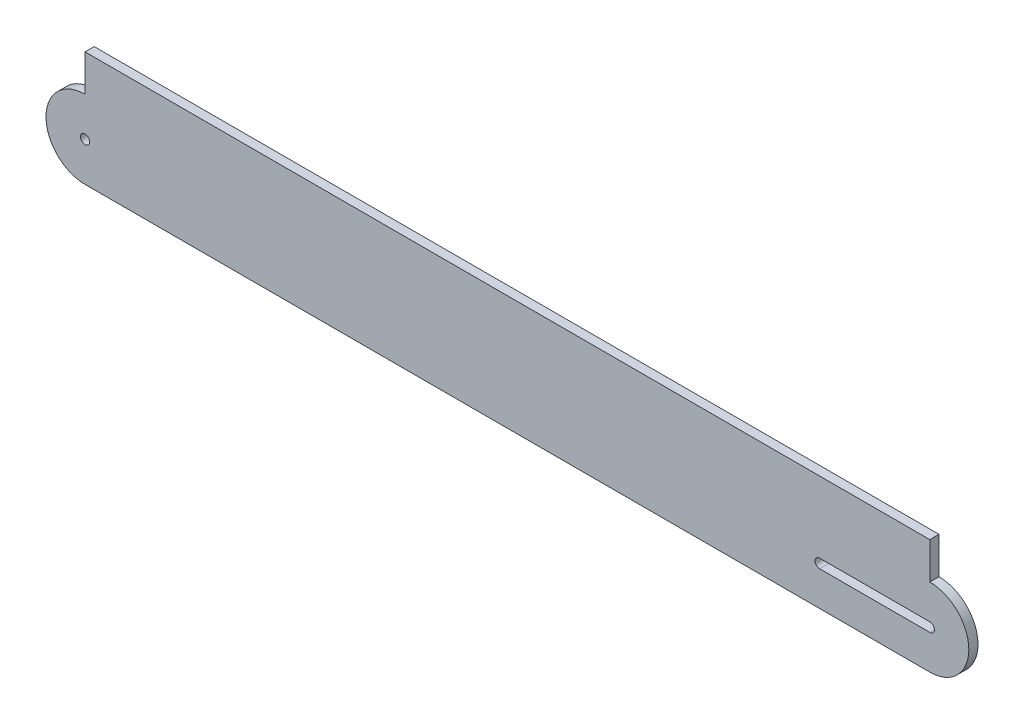
ISO-10303-21;
HEADER;
FILE_DESCRIPTION(('STEP AP214'),'2;1');
FILE_NAME('part.step','',(''),(''),'','','');
FILE_SCHEMA(('AUTOMOTIVE_DESIGN { 1 0 10303 214 1 1 1 1 }'));
ENDSEC;
DATA;
#1=APPLICATION_CONTEXT('core data for automotive mechanical design processes');
#2=APPLICATION_PROTOCOL_DEFINITION('international standard','automotive_design',2000,#1);
#3=PRODUCT_CONTEXT('',#1,'mechanical');
#4=PRODUCT('Part','Part','',(#3));
#5=PRODUCT_RELATED_PRODUCT_CATEGORY('part','',(#4));
#6=PRODUCT_DEFINITION_FORMATION('','',#4);
#7=PRODUCT_DEFINITION_CONTEXT('part definition',#1,'design');
#8=PRODUCT_DEFINITION('design','',#6,#7);
#9=PRODUCT_DEFINITION_SHAPE('','',#8);
#10=(LENGTH_UNIT() NAMED_UNIT(*) SI_UNIT(.MILLI.,.METRE.));
#11=(NAMED_UNIT(*) PLANE_ANGLE_UNIT() SI_UNIT($,.RADIAN.));
#12=(NAMED_UNIT(*) SI_UNIT($,.STERADIAN.) SOLID_ANGLE_UNIT());
#13=UNCERTAINTY_MEASURE_WITH_UNIT(LENGTH_MEASURE(1.E-05),#10,'distance_accuracy_value','');
#14=(GEOMETRIC_REPRESENTATION_CONTEXT(3) GLOBAL_UNCERTAINTY_ASSIGNED_CONTEXT((#13)) GLOBAL_UNIT_ASSIGNED_CONTEXT((#10,
#11,#12)) REPRESENTATION_CONTEXT('',''));
#15=CARTESIAN_POINT('',(0.,0.,0.));
#16=DIRECTION('',(0.,0.,1.));
#17=DIRECTION('',(1.,0.,0.));
#18=AXIS2_PLACEMENT_3D('',#15,#16,#17);
#19=CARTESIAN_POINT('',(0.,52.3875,3.175));
#20=DIRECTION('',(0.,1.,0.));
#21=DIRECTION('',(0.,0.,1.));
#22=AXIS2_PLACEMENT_3D('',#19,#20,#21);
#23=PLANE('',#22);
#24=DIRECTION('',(1.,0.,0.));
#25=VECTOR('',#24,1.);
#26=CARTESIAN_POINT('',(0.,52.3875,-3.175));
#27=LINE('',#26,#25);
#28=CARTESIAN_POINT('',(0.,52.3875,-3.175));
#29=VERTEX_POINT('',#28);
#30=CARTESIAN_POINT('',(584.2,52.3875,-3.175));
#31=VERTEX_POINT('',#30);
#32=EDGE_CURVE('E172',#29,#31,#27,.T.);
#33=ORIENTED_EDGE('',*,*,#32,.F.);
#34=DIRECTION('',(0.,0.,-1.));
#35=VECTOR('',#34,1.);
#36=CARTESIAN_POINT('',(0.,52.3875,3.175));
#37=LINE('',#36,#35);
#38=CARTESIAN_POINT('',(0.,52.3875,3.175));
#39=VERTEX_POINT('',#38);
#40=EDGE_CURVE('E12',#39,#29,#37,.T.);
#41=ORIENTED_EDGE('',*,*,#40,.F.);
#42=DIRECTION('',(1.,0.,0.));
#43=VECTOR('',#42,1.);
#44=CARTESIAN_POINT('',(0.,52.3875,3.175));
#45=LINE('',#44,#43);
#46=CARTESIAN_POINT('',(584.2,52.3875,3.175));
#47=VERTEX_POINT('',#46);
#48=EDGE_CURVE('E180',#39,#47,#45,.T.);
#49=ORIENTED_EDGE('',*,*,#48,.T.);
#50=DIRECTION('',(0.,0.,-1.));
#51=VECTOR('',#50,1.);
#52=CARTESIAN_POINT('',(584.2,52.3875,3.175));
#53=LINE('',#52,#51);
#54=EDGE_CURVE('E195',#47,#31,#53,.T.);
#55=ORIENTED_EDGE('',*,*,#54,.T.);
#56=EDGE_LOOP('',(#33,#41,#49,#55));
#57=FACE_BOUND('',#56,.T.);
#58=ADVANCED_FACE('F61',(#57),#23,.T.);
#59=CARTESIAN_POINT('',(0.,0.,3.175));
#60=DIRECTION('',(-1.,0.,0.));
#61=DIRECTION('',(0.,-1.,0.));
#62=AXIS2_PLACEMENT_3D('',#59,#60,#61);
#63=PLANE('',#62);
#64=DIRECTION('',(0.,1.,0.));
#65=VECTOR('',#64,1.);
#66=CARTESIAN_POINT('',(0.,0.,-3.175));
#67=LINE('',#66,#65);
#68=CARTESIAN_POINT('',(0.,26.9875,-3.175));
#69=VERTEX_POINT('',#68);
#70=EDGE_CURVE('E198',#69,#29,#67,.T.);
#71=ORIENTED_EDGE('',*,*,#70,.F.);
#72=DIRECTION('',(0.,0.,-1.));
#73=VECTOR('',#72,1.);
#74=CARTESIAN_POINT('',(0.,26.9875,3.175));
#75=LINE('',#74,#73);
#76=CARTESIAN_POINT('',(0.,26.9875,3.175));
#77=VERTEX_POINT('',#76);
#78=EDGE_CURVE('E68',#77,#69,#75,.T.);
#79=ORIENTED_EDGE('',*,*,#78,.F.);
#80=DIRECTION('',(0.,1.,0.));
#81=VECTOR('',#80,1.);
#82=CARTESIAN_POINT('',(0.,0.,3.175));
#83=LINE('',#82,#81);
#84=EDGE_CURVE('E183',#77,#39,#83,.T.);
#85=ORIENTED_EDGE('',*,*,#84,.T.);
#86=ORIENTED_EDGE('',*,*,#40,.T.);
#87=EDGE_LOOP('',(#71,#79,#85,#86));
#88=FACE_BOUND('',#87,.T.);
#89=ADVANCED_FACE('F229',(#88),#63,.T.);
#90=CARTESIAN_POINT('',(0.,0.,3.175));
#91=DIRECTION('',(0.,0.,-1.));
#92=DIRECTION('',(-1.,0.,0.));
#93=AXIS2_PLACEMENT_3D('',#90,#91,#92);
#94=CYLINDRICAL_SURFACE('',#93,26.9875);
#95=CARTESIAN_POINT('',(0.,0.,-3.175));
#96=DIRECTION('',(0.,0.,1.));
#97=DIRECTION('',(1.,0.,0.));
#98=AXIS2_PLACEMENT_3D('',#95,#96,#97);
#99=CIRCLE('',#98,26.9875);
#100=CARTESIAN_POINT('',(0.,-26.9875,-3.175));
#101=VERTEX_POINT('',#100);
#102=EDGE_CURVE('E201',#69,#101,#99,.T.);
#103=ORIENTED_EDGE('',*,*,#102,.T.);
#104=DIRECTION('',(0.,0.,-1.));
#105=VECTOR('',#104,1.);
#106=CARTESIAN_POINT('',(0.,-26.9875,3.175));
#107=LINE('',#106,#105);
#108=CARTESIAN_POINT('',(0.,-26.9875,3.175));
#109=VERTEX_POINT('',#108);
#110=EDGE_CURVE('E216',#109,#101,#107,.T.);
#111=ORIENTED_EDGE('',*,*,#110,.F.);
#112=CARTESIAN_POINT('',(0.,0.,3.175));
#113=DIRECTION('',(0.,0.,1.));
#114=DIRECTION('',(1.,0.,0.));
#115=AXIS2_PLACEMENT_3D('',#112,#113,#114);
#116=CIRCLE('',#115,26.9875);
#117=EDGE_CURVE('E187',#77,#109,#116,.T.);
#118=ORIENTED_EDGE('',*,*,#117,.F.);
#119=ORIENTED_EDGE('',*,*,#78,.T.);
#120=EDGE_LOOP('',(#103,#111,#118,#119));
#121=FACE_BOUND('',#120,.T.);
#122=ADVANCED_FACE('F221',(#121),#94,.T.);
#123=CARTESIAN_POINT('',(0.,-26.9875,3.175));
#124=DIRECTION('',(0.,1.,0.));
#125=DIRECTION('',(-1.,0.,0.));
#126=AXIS2_PLACEMENT_3D('',#123,#124,#125);
#127=PLANE('',#126);
#128=DIRECTION('',(1.,0.,0.));
#129=VECTOR('',#128,1.);
#130=CARTESIAN_POINT('',(0.,-26.9875,-3.175));
#131=LINE('',#130,#129);
#132=CARTESIAN_POINT('',(584.2,-26.9875,-3.175));
#133=VERTEX_POINT('',#132);
#134=EDGE_CURVE('E203',#101,#133,#131,.T.);
#135=ORIENTED_EDGE('',*,*,#134,.T.);
#136=DIRECTION('',(0.,0.,-1.));
#137=VECTOR('',#136,1.);
#138=CARTESIAN_POINT('',(584.2,-26.9875,3.175));
#139=LINE('',#138,#137);
#140=CARTESIAN_POINT('',(584.2,-26.9875,3.175));
#141=VERTEX_POINT('',#140);
#142=EDGE_CURVE('E213',#141,#133,#139,.T.);
#143=ORIENTED_EDGE('',*,*,#142,.F.);
#144=DIRECTION('',(1.,0.,0.));
#145=VECTOR('',#144,1.);
#146=CARTESIAN_POINT('',(0.,-26.9875,3.175));
#147=LINE('',#146,#145);
#148=EDGE_CURVE('E189',#109,#141,#147,.T.);
#149=ORIENTED_EDGE('',*,*,#148,.F.);
#150=ORIENTED_EDGE('',*,*,#110,.T.);
#151=EDGE_LOOP('',(#135,#143,#149,#150));
#152=FACE_BOUND('',#151,.T.);
#153=ADVANCED_FACE('F245',(#152),#127,.F.);
#154=CARTESIAN_POINT('',(584.2,0.,3.175));
#155=DIRECTION('',(0.,0.,-1.));
#156=DIRECTION('',(-1.,0.,0.));
#157=AXIS2_PLACEMENT_3D('',#154,#155,#156);
#158=CYLINDRICAL_SURFACE('',#157,26.9875);
#159=CARTESIAN_POINT('',(584.2,0.,-3.175));
#160=DIRECTION('',(0.,0.,1.));
#161=DIRECTION('',(1.,0.,0.));
#162=AXIS2_PLACEMENT_3D('',#159,#160,#161);
#163=CIRCLE('',#162,26.9875);
#164=CARTESIAN_POINT('',(584.2,26.9875,-3.175));
#165=VERTEX_POINT('',#164);
#166=EDGE_CURVE('E205',#133,#165,#163,.T.);
#167=ORIENTED_EDGE('',*,*,#166,.T.);
#168=DIRECTION('',(0.,0.,-1.));
#169=VECTOR('',#168,1.);
#170=CARTESIAN_POINT('',(584.2,26.9875,3.175));
#171=LINE('',#170,#169);
#172=CARTESIAN_POINT('',(584.2,26.9875,3.175));
#173=VERTEX_POINT('',#172);
#174=EDGE_CURVE('E210',#173,#165,#171,.T.);
#175=ORIENTED_EDGE('',*,*,#174,.F.);
#176=CARTESIAN_POINT('',(584.2,0.,3.175));
#177=DIRECTION('',(0.,0.,1.));
#178=DIRECTION('',(1.,0.,0.));
#179=AXIS2_PLACEMENT_3D('',#176,#177,#178);
#180=CIRCLE('',#179,26.9875);
#181=EDGE_CURVE('E191',#141,#173,#180,.T.);
#182=ORIENTED_EDGE('',*,*,#181,.F.);
#183=ORIENTED_EDGE('',*,*,#142,.T.);
#184=EDGE_LOOP('',(#167,#175,#182,#183));
#185=FACE_BOUND('',#184,.T.);
#186=ADVANCED_FACE('F241',(#185),#158,.T.);
#187=CARTESIAN_POINT('',(584.2,0.,3.175));
#188=DIRECTION('',(-1.,0.,0.));
#189=DIRECTION('',(0.,0.,1.));
#190=AXIS2_PLACEMENT_3D('',#187,#188,#189);
#191=PLANE('',#190);
#192=DIRECTION('',(0.,1.,0.));
#193=VECTOR('',#192,1.);
#194=CARTESIAN_POINT('',(584.2,0.,-3.175));
#195=LINE('',#194,#193);
#196=EDGE_CURVE('E184',#165,#31,#195,.T.);
#197=ORIENTED_EDGE('',*,*,#196,.T.);
#198=ORIENTED_EDGE('',*,*,#54,.F.);
#199=DIRECTION('',(0.,1.,0.));
#200=VECTOR('',#199,1.);
#201=CARTESIAN_POINT('',(584.2,0.,3.175));
#202=LINE('',#201,#200);
#203=EDGE_CURVE('E193',#173,#47,#202,.T.);
#204=ORIENTED_EDGE('',*,*,#203,.F.);
#205=ORIENTED_EDGE('',*,*,#174,.T.);
#206=EDGE_LOOP('',(#197,#198,#204,#205));
#207=FACE_BOUND('',#206,.T.);
#208=ADVANCED_FACE('F236',(#207),#191,.F.);
#209=CARTESIAN_POINT('',(0.,0.,3.175));
#210=DIRECTION('',(0.,0.,1.));
#211=DIRECTION('',(1.,0.,0.));
#212=AXIS2_PLACEMENT_3D('',#209,#210,#211);
#213=PLANE('',#212);
#214=CARTESIAN_POINT('',(584.2,0.,3.175));
#215=DIRECTION('',(0.,0.,1.));
#216=DIRECTION('',(1.,0.,0.));
#217=AXIS2_PLACEMENT_3D('',#214,#215,#216);
#218=CIRCLE('',#217,3.17499999999993);
#219=CARTESIAN_POINT('',(584.2,-3.17499999999993,3.175));
#220=VERTEX_POINT('',#219);
#221=CARTESIAN_POINT('',(584.2,3.17499999999993,3.175));
#222=VERTEX_POINT('',#221);
#223=EDGE_CURVE('E75',#220,#222,#218,.T.);
#224=ORIENTED_EDGE('',*,*,#223,.F.);
#225=DIRECTION('',(1.,0.,0.));
#226=VECTOR('',#225,1.);
#227=CARTESIAN_POINT('',(0.,-3.17499999999993,3.175));
#228=LINE('',#227,#226);
#229=CARTESIAN_POINT('',(508.,-3.17499999999993,3.175));
#230=VERTEX_POINT('',#229);
#231=EDGE_CURVE('E167',#230,#220,#228,.T.);
#232=ORIENTED_EDGE('',*,*,#231,.F.);
#233=CARTESIAN_POINT('',(508.,0.,3.175));
#234=DIRECTION('',(0.,0.,1.));
#235=DIRECTION('',(1.,0.,0.));
#236=AXIS2_PLACEMENT_3D('',#233,#234,#235);
#237=CIRCLE('',#236,3.17499999999993);
#238=CARTESIAN_POINT('',(508.,3.17499999999993,3.175));
#239=VERTEX_POINT('',#238);
#240=EDGE_CURVE('E139',#239,#230,#237,.T.);
#241=ORIENTED_EDGE('',*,*,#240,.F.);
#242=DIRECTION('',(1.,0.,0.));
#243=VECTOR('',#242,1.);
#244=CARTESIAN_POINT('',(0.,3.17499999999993,3.175));
#245=LINE('',#244,#243);
#246=EDGE_CURVE('E162',#239,#222,#245,.T.);
#247=ORIENTED_EDGE('',*,*,#246,.T.);
#248=EDGE_LOOP('',(#224,#232,#241,#247));
#249=FACE_BOUND('',#248,.T.);
#250=CARTESIAN_POINT('',(0.,0.,3.175));
#251=DIRECTION('',(0.,0.,1.));
#252=DIRECTION('',(1.,0.,0.));
#253=AXIS2_PLACEMENT_3D('',#250,#251,#252);
#254=CIRCLE('',#253,3.175);
#255=CARTESIAN_POINT('',(3.175,0.,3.175));
#256=VERTEX_POINT('',#255);
#257=EDGE_CURVE('E165',#256,#256,#254,.T.);
#258=ORIENTED_EDGE('',*,*,#257,.F.);
#259=EDGE_LOOP('',(#258));
#260=FACE_BOUND('',#259,.T.);
#261=ORIENTED_EDGE('',*,*,#48,.F.);
#262=ORIENTED_EDGE('',*,*,#84,.F.);
#263=ORIENTED_EDGE('',*,*,#117,.T.);
#264=ORIENTED_EDGE('',*,*,#148,.T.);
#265=ORIENTED_EDGE('',*,*,#181,.T.);
#266=ORIENTED_EDGE('',*,*,#203,.T.);
#267=EDGE_LOOP('',(#261,#262,#263,#264,#265,#266));
#268=FACE_BOUND('',#267,.T.);
#269=ADVANCED_FACE('F247',(#249,#260,#268),#213,.T.);
#270=CARTESIAN_POINT('',(0.,0.,-3.175));
#271=DIRECTION('',(0.,0.,1.));
#272=DIRECTION('',(1.,0.,0.));
#273=AXIS2_PLACEMENT_3D('',#270,#271,#272);
#274=PLANE('',#273);
#275=DIRECTION('',(1.,0.,0.));
#276=VECTOR('',#275,1.);
#277=CARTESIAN_POINT('',(0.,-3.17499999999993,-3.175));
#278=LINE('',#277,#276);
#279=CARTESIAN_POINT('',(508.,-3.17499999999993,-3.175));
#280=VERTEX_POINT('',#279);
#281=CARTESIAN_POINT('',(584.2,-3.17499999999993,-3.175));
#282=VERTEX_POINT('',#281);
#283=EDGE_CURVE('E147',#280,#282,#278,.T.);
#284=ORIENTED_EDGE('',*,*,#283,.T.);
#285=CARTESIAN_POINT('',(584.2,0.,-3.175));
#286=DIRECTION('',(0.,0.,1.));
#287=DIRECTION('',(1.,0.,0.));
#288=AXIS2_PLACEMENT_3D('',#285,#286,#287);
#289=CIRCLE('',#288,3.17499999999993);
#290=CARTESIAN_POINT('',(584.2,3.17499999999993,-3.175));
#291=VERTEX_POINT('',#290);
#292=EDGE_CURVE('E152',#282,#291,#289,.T.);
#293=ORIENTED_EDGE('',*,*,#292,.T.);
#294=DIRECTION('',(1.,0.,0.));
#295=VECTOR('',#294,1.);
#296=CARTESIAN_POINT('',(0.,3.17499999999993,-3.175));
#297=LINE('',#296,#295);
#298=CARTESIAN_POINT('',(508.,3.17499999999993,-3.175));
#299=VERTEX_POINT('',#298);
#300=EDGE_CURVE('E157',#299,#291,#297,.T.);
#301=ORIENTED_EDGE('',*,*,#300,.F.);
#302=CARTESIAN_POINT('',(508.,0.,-3.175));
#303=DIRECTION('',(0.,0.,1.));
#304=DIRECTION('',(1.,0.,0.));
#305=AXIS2_PLACEMENT_3D('',#302,#303,#304);
#306=CIRCLE('',#305,3.17499999999993);
#307=EDGE_CURVE('E83',#299,#280,#306,.T.);
#308=ORIENTED_EDGE('',*,*,#307,.T.);
#309=EDGE_LOOP('',(#284,#293,#301,#308));
#310=FACE_BOUND('',#309,.T.);
#311=CARTESIAN_POINT('',(0.,0.,-3.175));
#312=DIRECTION('',(0.,0.,1.));
#313=DIRECTION('',(1.,0.,0.));
#314=AXIS2_PLACEMENT_3D('',#311,#312,#313);
#315=CIRCLE('',#314,3.175);
#316=CARTESIAN_POINT('',(3.175,0.,-3.175));
#317=VERTEX_POINT('',#316);
#318=EDGE_CURVE('E177',#317,#317,#315,.T.);
#319=ORIENTED_EDGE('',*,*,#318,.T.);
#320=EDGE_LOOP('',(#319));
#321=FACE_BOUND('',#320,.T.);
#322=ORIENTED_EDGE('',*,*,#32,.T.);
#323=ORIENTED_EDGE('',*,*,#196,.F.);
#324=ORIENTED_EDGE('',*,*,#166,.F.);
#325=ORIENTED_EDGE('',*,*,#134,.F.);
#326=ORIENTED_EDGE('',*,*,#102,.F.);
#327=ORIENTED_EDGE('',*,*,#70,.T.);
#328=EDGE_LOOP('',(#322,#323,#324,#325,#326,#327));
#329=FACE_BOUND('',#328,.T.);
#330=ADVANCED_FACE('F155',(#310,#321,#329),#274,.F.);
#331=CARTESIAN_POINT('',(0.,0.,-3.175));
#332=DIRECTION('',(0.,0.,1.));
#333=DIRECTION('',(1.,0.,0.));
#334=AXIS2_PLACEMENT_3D('',#331,#332,#333);
#335=CYLINDRICAL_SURFACE('',#334,3.175);
#336=ORIENTED_EDGE('',*,*,#318,.F.);
#337=EDGE_LOOP('',(#336));
#338=FACE_BOUND('',#337,.T.);
#339=ORIENTED_EDGE('',*,*,#257,.T.);
#340=EDGE_LOOP('',(#339));
#341=FACE_BOUND('',#340,.T.);
#342=ADVANCED_FACE('F255',(#338,#341),#335,.F.);
#343=CARTESIAN_POINT('',(584.2,0.,-3.175));
#344=DIRECTION('',(0.,0.,1.));
#345=DIRECTION('',(1.,0.,0.));
#346=AXIS2_PLACEMENT_3D('',#343,#344,#345);
#347=CYLINDRICAL_SURFACE('',#346,3.17499999999993);
#348=ORIENTED_EDGE('',*,*,#223,.T.);
#349=DIRECTION('',(0.,0.,1.));
#350=VECTOR('',#349,1.);
#351=CARTESIAN_POINT('',(584.2,3.17499999999993,-3.175));
#352=LINE('',#351,#350);
#353=EDGE_CURVE('E170',#291,#222,#352,.T.);
#354=ORIENTED_EDGE('',*,*,#353,.F.);
#355=ORIENTED_EDGE('',*,*,#292,.F.);
#356=DIRECTION('',(0.,0.,1.));
#357=VECTOR('',#356,1.);
#358=CARTESIAN_POINT('',(584.2,-3.17499999999993,-3.175));
#359=LINE('',#358,#357);
#360=EDGE_CURVE('E143',#282,#220,#359,.T.);
#361=ORIENTED_EDGE('',*,*,#360,.T.);
#362=EDGE_LOOP('',(#348,#354,#355,#361));
#363=FACE_BOUND('',#362,.T.);
#364=ADVANCED_FACE('F301',(#363),#347,.F.);
#365=CARTESIAN_POINT('',(0.,-3.17499999999993,-3.175));
#366=DIRECTION('',(0.,-1.,0.));
#367=DIRECTION('',(0.,0.,-1.));
#368=AXIS2_PLACEMENT_3D('',#365,#366,#367);
#369=PLANE('',#368);
#370=ORIENTED_EDGE('',*,*,#231,.T.);
#371=ORIENTED_EDGE('',*,*,#360,.F.);
#372=ORIENTED_EDGE('',*,*,#283,.F.);
#373=DIRECTION('',(0.,0.,1.));
#374=VECTOR('',#373,1.);
#375=CARTESIAN_POINT('',(508.,-3.17499999999993,-3.175));
#376=LINE('',#375,#374);
#377=EDGE_CURVE('E135',#280,#230,#376,.T.);
#378=ORIENTED_EDGE('',*,*,#377,.T.);
#379=EDGE_LOOP('',(#370,#371,#372,#378));
#380=FACE_BOUND('',#379,.T.);
#381=ADVANCED_FACE('F148',(#380),#369,.F.);
#382=CARTESIAN_POINT('',(508.,0.,-3.175));
#383=DIRECTION('',(0.,0.,1.));
#384=DIRECTION('',(1.,0.,0.));
#385=AXIS2_PLACEMENT_3D('',#382,#383,#384);
#386=CYLINDRICAL_SURFACE('',#385,3.17499999999993);
#387=ORIENTED_EDGE('',*,*,#240,.T.);
#388=ORIENTED_EDGE('',*,*,#377,.F.);
#389=ORIENTED_EDGE('',*,*,#307,.F.);
#390=DIRECTION('',(0.,0.,1.));
#391=VECTOR('',#390,1.);
#392=CARTESIAN_POINT('',(508.,3.17499999999993,-3.175));
#393=LINE('',#392,#391);
#394=EDGE_CURVE('E144',#299,#239,#393,.T.);
#395=ORIENTED_EDGE('',*,*,#394,.T.);
#396=EDGE_LOOP('',(#387,#388,#389,#395));
#397=FACE_BOUND('',#396,.T.);
#398=ADVANCED_FACE('F137',(#397),#386,.F.);
#399=CARTESIAN_POINT('',(0.,3.17499999999993,-3.175));
#400=DIRECTION('',(0.,-1.,0.));
#401=DIRECTION('',(0.,0.,-1.));
#402=AXIS2_PLACEMENT_3D('',#399,#400,#401);
#403=PLANE('',#402);
#404=ORIENTED_EDGE('',*,*,#246,.F.);
#405=ORIENTED_EDGE('',*,*,#394,.F.);
#406=ORIENTED_EDGE('',*,*,#300,.T.);
#407=ORIENTED_EDGE('',*,*,#353,.T.);
#408=EDGE_LOOP('',(#404,#405,#406,#407));
#409=FACE_BOUND('',#408,.T.);
#410=ADVANCED_FACE('F329',(#409),#403,.T.);
#411=CLOSED_SHELL('',(#58,#89,#122,#153,#186,#208,#269,#330,#342,#364,#381,#398,#410));
#412=MANIFOLD_SOLID_BREP('B2',#411);
#413=ADVANCED_BREP_SHAPE_REPRESENTATION('',(#18,#412),#14);
#414=SHAPE_DEFINITION_REPRESENTATION(#9,#413);
ENDSEC;
END-ISO-10303-21;
